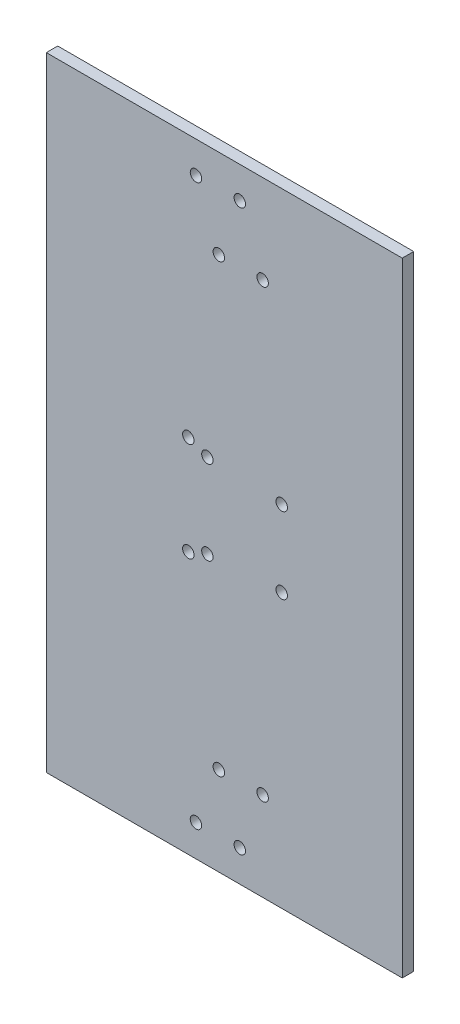
ISO-10303-21;
HEADER;
FILE_DESCRIPTION(('STEP AP214'),'2;1');
FILE_NAME('part.step','',(''),(''),'','','');
FILE_SCHEMA(('AUTOMOTIVE_DESIGN { 1 0 10303 214 1 1 1 1 }'));
ENDSEC;
DATA;
#1=APPLICATION_CONTEXT('core data for automotive mechanical design processes');
#2=APPLICATION_PROTOCOL_DEFINITION('international standard','automotive_design',2000,#1);
#3=PRODUCT_CONTEXT('',#1,'mechanical');
#4=PRODUCT('Part','Part','',(#3));
#5=PRODUCT_RELATED_PRODUCT_CATEGORY('part','',(#4));
#6=PRODUCT_DEFINITION_FORMATION('','',#4);
#7=PRODUCT_DEFINITION_CONTEXT('part definition',#1,'design');
#8=PRODUCT_DEFINITION('design','',#6,#7);
#9=PRODUCT_DEFINITION_SHAPE('','',#8);
#10=(LENGTH_UNIT() NAMED_UNIT(*) SI_UNIT(.MILLI.,.METRE.));
#11=(NAMED_UNIT(*) PLANE_ANGLE_UNIT() SI_UNIT($,.RADIAN.));
#12=(NAMED_UNIT(*) SI_UNIT($,.STERADIAN.) SOLID_ANGLE_UNIT());
#13=UNCERTAINTY_MEASURE_WITH_UNIT(LENGTH_MEASURE(1.E-05),#10,'distance_accuracy_value','');
#14=(GEOMETRIC_REPRESENTATION_CONTEXT(3) GLOBAL_UNCERTAINTY_ASSIGNED_CONTEXT((#13)) GLOBAL_UNIT_ASSIGNED_CONTEXT((#10,
#11,#12)) REPRESENTATION_CONTEXT('',''));
#15=CARTESIAN_POINT('',(0.,0.,0.));
#16=DIRECTION('',(0.,0.,1.));
#17=DIRECTION('',(1.,0.,0.));
#18=AXIS2_PLACEMENT_3D('',#15,#16,#17);
#19=CARTESIAN_POINT('',(0.,0.,3.));
#20=DIRECTION('',(0.,0.,1.));
#21=DIRECTION('',(1.,0.,0.));
#22=AXIS2_PLACEMENT_3D('',#19,#20,#21);
#23=PLANE('',#22);
#24=CARTESIAN_POINT('',(1.99999999999999,58.5,3.));
#25=DIRECTION('',(0.,0.,1.));
#26=DIRECTION('',(1.,0.,0.));
#27=AXIS2_PLACEMENT_3D('',#24,#25,#26);
#28=CIRCLE('',#27,1.5);
#29=CARTESIAN_POINT('',(3.5,58.5,3.));
#30=VERTEX_POINT('',#29);
#31=EDGE_CURVE('E320',#30,#30,#28,.T.);
#32=ORIENTED_EDGE('',*,*,#31,.F.);
#33=EDGE_LOOP('',(#32));
#34=FACE_BOUND('',#33,.T.);
#35=CARTESIAN_POINT('',(-1.,11.,3.));
#36=DIRECTION('',(0.,0.,1.));
#37=DIRECTION('',(1.,0.,0.));
#38=AXIS2_PLACEMENT_3D('',#35,#36,#37);
#39=CIRCLE('',#38,1.5);
#40=CARTESIAN_POINT('',(0.499999999999999,11.,3.));
#41=VERTEX_POINT('',#40);
#42=EDGE_CURVE('E332',#41,#41,#39,.T.);
#43=ORIENTED_EDGE('',*,*,#42,.F.);
#44=EDGE_LOOP('',(#43));
#45=FACE_BOUND('',#44,.T.);
#46=CARTESIAN_POINT('',(7.49999999999999,73.5,3.));
#47=DIRECTION('',(0.,0.,1.));
#48=DIRECTION('',(1.,0.,0.));
#49=AXIS2_PLACEMENT_3D('',#46,#47,#48);
#50=CIRCLE('',#49,1.5);
#51=CARTESIAN_POINT('',(8.99999999999999,73.5,3.));
#52=VERTEX_POINT('',#51);
#53=EDGE_CURVE('E344',#52,#52,#50,.T.);
#54=ORIENTED_EDGE('',*,*,#53,.F.);
#55=EDGE_LOOP('',(#54));
#56=FACE_BOUND('',#55,.T.);
#57=DIRECTION('',(0.,1.,0.));
#58=VECTOR('',#57,1.);
#59=CARTESIAN_POINT('',(-43.264162630959,0.,3.));
#60=LINE('',#59,#58);
#61=CARTESIAN_POINT('',(-43.264162630959,-81.7904457096533,3.));
#62=VERTEX_POINT('',#61);
#63=CARTESIAN_POINT('',(-43.264162630959,81.7904457096533,3.));
#64=VERTEX_POINT('',#63);
#65=EDGE_CURVE('E358',#62,#64,#60,.T.);
#66=ORIENTED_EDGE('',*,*,#65,.F.);
#67=DIRECTION('',(1.,0.,0.));
#68=VECTOR('',#67,1.);
#69=CARTESIAN_POINT('',(-43.264162630959,-81.7904457096533,3.));
#70=LINE('',#69,#68);
#71=CARTESIAN_POINT('',(50.1298788763802,-81.7904457096533,3.));
#72=VERTEX_POINT('',#71);
#73=EDGE_CURVE('E299',#62,#72,#70,.T.);
#74=ORIENTED_EDGE('',*,*,#73,.T.);
#75=DIRECTION('',(0.,1.,0.));
#76=VECTOR('',#75,1.);
#77=CARTESIAN_POINT('',(50.1298788763802,0.,3.));
#78=LINE('',#77,#76);
#79=CARTESIAN_POINT('',(50.1298788763802,81.7904457096533,3.));
#80=VERTEX_POINT('',#79);
#81=EDGE_CURVE('E273',#72,#80,#78,.T.);
#82=ORIENTED_EDGE('',*,*,#81,.T.);
#83=DIRECTION('',(1.,0.,0.));
#84=VECTOR('',#83,1.);
#85=CARTESIAN_POINT('',(-43.264162630959,81.7904457096533,3.));
#86=LINE('',#85,#84);
#87=EDGE_CURVE('E355',#64,#80,#86,.T.);
#88=ORIENTED_EDGE('',*,*,#87,.F.);
#89=EDGE_LOOP('',(#66,#74,#82,#88));
#90=FACE_BOUND('',#89,.T.);
#91=CARTESIAN_POINT('',(18.5,10.,3.));
#92=DIRECTION('',(0.,0.,1.));
#93=DIRECTION('',(1.,0.,0.));
#94=AXIS2_PLACEMENT_3D('',#91,#92,#93);
#95=CIRCLE('',#94,1.5);
#96=CARTESIAN_POINT('',(20.,10.,3.));
#97=VERTEX_POINT('',#96);
#98=EDGE_CURVE('E292',#97,#97,#95,.T.);
#99=ORIENTED_EDGE('',*,*,#98,.F.);
#100=EDGE_LOOP('',(#99));
#101=FACE_BOUND('',#100,.T.);
#102=CARTESIAN_POINT('',(-6.,13.,3.));
#103=DIRECTION('',(0.,0.,1.));
#104=DIRECTION('',(1.,0.,0.));
#105=AXIS2_PLACEMENT_3D('',#102,#103,#104);
#106=CIRCLE('',#105,1.5);
#107=CARTESIAN_POINT('',(-4.5,13.,3.));
#108=VERTEX_POINT('',#107);
#109=EDGE_CURVE('E338',#108,#108,#106,.T.);
#110=ORIENTED_EDGE('',*,*,#109,.F.);
#111=EDGE_LOOP('',(#110));
#112=FACE_BOUND('',#111,.T.);
#113=CARTESIAN_POINT('',(13.5,58.5,3.));
#114=DIRECTION('',(0.,0.,1.));
#115=DIRECTION('',(1.,0.,0.));
#116=AXIS2_PLACEMENT_3D('',#113,#114,#115);
#117=CIRCLE('',#116,1.5);
#118=CARTESIAN_POINT('',(15.,58.5,3.));
#119=VERTEX_POINT('',#118);
#120=EDGE_CURVE('E326',#119,#119,#117,.T.);
#121=ORIENTED_EDGE('',*,*,#120,.F.);
#122=EDGE_LOOP('',(#121));
#123=FACE_BOUND('',#122,.T.);
#124=CARTESIAN_POINT('',(-4.00000000000001,73.5,3.));
#125=DIRECTION('',(0.,0.,1.));
#126=DIRECTION('',(1.,0.,0.));
#127=AXIS2_PLACEMENT_3D('',#124,#125,#126);
#128=CIRCLE('',#127,1.5);
#129=CARTESIAN_POINT('',(-2.50000000000001,73.5,3.));
#130=VERTEX_POINT('',#129);
#131=EDGE_CURVE('E314',#130,#130,#128,.T.);
#132=ORIENTED_EDGE('',*,*,#131,.F.);
#133=EDGE_LOOP('',(#132));
#134=FACE_BOUND('',#133,.T.);
#135=CARTESIAN_POINT('',(-4.00000000000001,-73.5,3.));
#136=DIRECTION('',(0.,0.,-1.));
#137=DIRECTION('',(1.,0.,0.));
#138=AXIS2_PLACEMENT_3D('',#135,#136,#137);
#139=CIRCLE('',#138,1.5);
#140=CARTESIAN_POINT('',(-2.50000000000001,-73.5,3.));
#141=VERTEX_POINT('',#140);
#142=EDGE_CURVE('E443',#141,#141,#139,.T.);
#143=ORIENTED_EDGE('',*,*,#142,.T.);
#144=EDGE_LOOP('',(#143));
#145=FACE_BOUND('',#144,.T.);
#146=CARTESIAN_POINT('',(1.99999999999999,-58.5,3.));
#147=DIRECTION('',(0.,0.,-1.));
#148=DIRECTION('',(1.,0.,0.));
#149=AXIS2_PLACEMENT_3D('',#146,#147,#148);
#150=CIRCLE('',#149,1.5);
#151=CARTESIAN_POINT('',(3.5,-58.5,3.));
#152=VERTEX_POINT('',#151);
#153=EDGE_CURVE('E452',#152,#152,#150,.T.);
#154=ORIENTED_EDGE('',*,*,#153,.T.);
#155=EDGE_LOOP('',(#154));
#156=FACE_BOUND('',#155,.T.);
#157=CARTESIAN_POINT('',(13.5,-58.5,3.));
#158=DIRECTION('',(0.,0.,-1.));
#159=DIRECTION('',(1.,0.,0.));
#160=AXIS2_PLACEMENT_3D('',#157,#158,#159);
#161=CIRCLE('',#160,1.5);
#162=CARTESIAN_POINT('',(15.,-58.5,3.));
#163=VERTEX_POINT('',#162);
#164=EDGE_CURVE('E458',#163,#163,#161,.T.);
#165=ORIENTED_EDGE('',*,*,#164,.T.);
#166=EDGE_LOOP('',(#165));
#167=FACE_BOUND('',#166,.T.);
#168=CARTESIAN_POINT('',(-1.,-11.,3.));
#169=DIRECTION('',(0.,0.,-1.));
#170=DIRECTION('',(1.,0.,0.));
#171=AXIS2_PLACEMENT_3D('',#168,#169,#170);
#172=CIRCLE('',#171,1.5);
#173=CARTESIAN_POINT('',(0.499999999999999,-11.,3.));
#174=VERTEX_POINT('',#173);
#175=EDGE_CURVE('E464',#174,#174,#172,.T.);
#176=ORIENTED_EDGE('',*,*,#175,.T.);
#177=EDGE_LOOP('',(#176));
#178=FACE_BOUND('',#177,.T.);
#179=CARTESIAN_POINT('',(-6.,-13.,3.));
#180=DIRECTION('',(0.,0.,-1.));
#181=DIRECTION('',(1.,0.,0.));
#182=AXIS2_PLACEMENT_3D('',#179,#180,#181);
#183=CIRCLE('',#182,1.5);
#184=CARTESIAN_POINT('',(-4.5,-13.,3.));
#185=VERTEX_POINT('',#184);
#186=EDGE_CURVE('E470',#185,#185,#183,.T.);
#187=ORIENTED_EDGE('',*,*,#186,.T.);
#188=EDGE_LOOP('',(#187));
#189=FACE_BOUND('',#188,.T.);
#190=CARTESIAN_POINT('',(7.49999999999999,-73.5,3.));
#191=DIRECTION('',(0.,0.,-1.));
#192=DIRECTION('',(1.,0.,0.));
#193=AXIS2_PLACEMENT_3D('',#190,#191,#192);
#194=CIRCLE('',#193,1.5);
#195=CARTESIAN_POINT('',(8.99999999999999,-73.5,3.));
#196=VERTEX_POINT('',#195);
#197=EDGE_CURVE('E476',#196,#196,#194,.T.);
#198=ORIENTED_EDGE('',*,*,#197,.T.);
#199=EDGE_LOOP('',(#198));
#200=FACE_BOUND('',#199,.T.);
#201=CARTESIAN_POINT('',(18.5,-10.,3.));
#202=DIRECTION('',(0.,0.,-1.));
#203=DIRECTION('',(1.,0.,0.));
#204=AXIS2_PLACEMENT_3D('',#201,#202,#203);
#205=CIRCLE('',#204,1.5);
#206=CARTESIAN_POINT('',(20.,-10.,3.));
#207=VERTEX_POINT('',#206);
#208=EDGE_CURVE('E304',#207,#207,#205,.T.);
#209=ORIENTED_EDGE('',*,*,#208,.T.);
#210=EDGE_LOOP('',(#209));
#211=FACE_BOUND('',#210,.T.);
#212=ADVANCED_FACE('F243',(#34,#45,#56,#90,#101,#112,#123,#134,#145,#156,#167,#178,#189,#200,
#211),#23,.T.);
#213=CARTESIAN_POINT('',(0.,0.,0.));
#214=DIRECTION('',(0.,0.,1.));
#215=DIRECTION('',(1.,0.,0.));
#216=AXIS2_PLACEMENT_3D('',#213,#214,#215);
#217=PLANE('',#216);
#218=DIRECTION('',(0.,1.,0.));
#219=VECTOR('',#218,1.);
#220=CARTESIAN_POINT('',(50.1298788763802,0.,0.));
#221=LINE('',#220,#219);
#222=CARTESIAN_POINT('',(50.1298788763802,-81.7904457096533,0.));
#223=VERTEX_POINT('',#222);
#224=CARTESIAN_POINT('',(50.1298788763802,81.7904457096533,0.));
#225=VERTEX_POINT('',#224);
#226=EDGE_CURVE('E285',#223,#225,#221,.T.);
#227=ORIENTED_EDGE('',*,*,#226,.F.);
#228=DIRECTION('',(1.,0.,0.));
#229=VECTOR('',#228,1.);
#230=CARTESIAN_POINT('',(-43.264162630959,-81.7904457096533,0.));
#231=LINE('',#230,#229);
#232=CARTESIAN_POINT('',(-43.264162630959,-81.7904457096533,0.));
#233=VERTEX_POINT('',#232);
#234=EDGE_CURVE('E290',#233,#223,#231,.T.);
#235=ORIENTED_EDGE('',*,*,#234,.F.);
#236=DIRECTION('',(0.,1.,0.));
#237=VECTOR('',#236,1.);
#238=CARTESIAN_POINT('',(-43.264162630959,0.,0.));
#239=LINE('',#238,#237);
#240=CARTESIAN_POINT('',(-43.264162630959,81.7904457096533,0.));
#241=VERTEX_POINT('',#240);
#242=EDGE_CURVE('E356',#233,#241,#239,.T.);
#243=ORIENTED_EDGE('',*,*,#242,.T.);
#244=DIRECTION('',(1.,0.,0.));
#245=VECTOR('',#244,1.);
#246=CARTESIAN_POINT('',(-43.264162630959,81.7904457096533,0.));
#247=LINE('',#246,#245);
#248=EDGE_CURVE('E291',#241,#225,#247,.T.);
#249=ORIENTED_EDGE('',*,*,#248,.T.);
#250=EDGE_LOOP('',(#227,#235,#243,#249));
#251=FACE_BOUND('',#250,.T.);
#252=CARTESIAN_POINT('',(18.5,10.,0.));
#253=DIRECTION('',(0.,0.,1.));
#254=DIRECTION('',(1.,0.,0.));
#255=AXIS2_PLACEMENT_3D('',#252,#253,#254);
#256=CIRCLE('',#255,1.5);
#257=CARTESIAN_POINT('',(20.,10.,0.));
#258=VERTEX_POINT('',#257);
#259=EDGE_CURVE('E347',#258,#258,#256,.T.);
#260=ORIENTED_EDGE('',*,*,#259,.T.);
#261=EDGE_LOOP('',(#260));
#262=FACE_BOUND('',#261,.T.);
#263=CARTESIAN_POINT('',(7.49999999999999,73.5,0.));
#264=DIRECTION('',(0.,0.,1.));
#265=DIRECTION('',(1.,0.,0.));
#266=AXIS2_PLACEMENT_3D('',#263,#264,#265);
#267=CIRCLE('',#266,1.5);
#268=CARTESIAN_POINT('',(8.99999999999999,73.5,0.));
#269=VERTEX_POINT('',#268);
#270=EDGE_CURVE('E341',#269,#269,#267,.T.);
#271=ORIENTED_EDGE('',*,*,#270,.T.);
#272=EDGE_LOOP('',(#271));
#273=FACE_BOUND('',#272,.T.);
#274=CARTESIAN_POINT('',(-6.,13.,0.));
#275=DIRECTION('',(0.,0.,1.));
#276=DIRECTION('',(1.,0.,0.));
#277=AXIS2_PLACEMENT_3D('',#274,#275,#276);
#278=CIRCLE('',#277,1.5);
#279=CARTESIAN_POINT('',(-4.5,13.,0.));
#280=VERTEX_POINT('',#279);
#281=EDGE_CURVE('E335',#280,#280,#278,.T.);
#282=ORIENTED_EDGE('',*,*,#281,.T.);
#283=EDGE_LOOP('',(#282));
#284=FACE_BOUND('',#283,.T.);
#285=CARTESIAN_POINT('',(-1.,11.,0.));
#286=DIRECTION('',(0.,0.,1.));
#287=DIRECTION('',(1.,0.,0.));
#288=AXIS2_PLACEMENT_3D('',#285,#286,#287);
#289=CIRCLE('',#288,1.5);
#290=CARTESIAN_POINT('',(0.499999999999999,11.,0.));
#291=VERTEX_POINT('',#290);
#292=EDGE_CURVE('E329',#291,#291,#289,.T.);
#293=ORIENTED_EDGE('',*,*,#292,.T.);
#294=EDGE_LOOP('',(#293));
#295=FACE_BOUND('',#294,.T.);
#296=CARTESIAN_POINT('',(13.5,58.5,0.));
#297=DIRECTION('',(0.,0.,1.));
#298=DIRECTION('',(1.,0.,0.));
#299=AXIS2_PLACEMENT_3D('',#296,#297,#298);
#300=CIRCLE('',#299,1.5);
#301=CARTESIAN_POINT('',(15.,58.5,0.));
#302=VERTEX_POINT('',#301);
#303=EDGE_CURVE('E323',#302,#302,#300,.T.);
#304=ORIENTED_EDGE('',*,*,#303,.T.);
#305=EDGE_LOOP('',(#304));
#306=FACE_BOUND('',#305,.T.);
#307=CARTESIAN_POINT('',(1.99999999999999,58.5,0.));
#308=DIRECTION('',(0.,0.,1.));
#309=DIRECTION('',(1.,0.,0.));
#310=AXIS2_PLACEMENT_3D('',#307,#308,#309);
#311=CIRCLE('',#310,1.5);
#312=CARTESIAN_POINT('',(3.5,58.5,0.));
#313=VERTEX_POINT('',#312);
#314=EDGE_CURVE('E317',#313,#313,#311,.T.);
#315=ORIENTED_EDGE('',*,*,#314,.T.);
#316=EDGE_LOOP('',(#315));
#317=FACE_BOUND('',#316,.T.);
#318=CARTESIAN_POINT('',(-4.00000000000001,73.5,0.));
#319=DIRECTION('',(0.,0.,1.));
#320=DIRECTION('',(1.,0.,0.));
#321=AXIS2_PLACEMENT_3D('',#318,#319,#320);
#322=CIRCLE('',#321,1.5);
#323=CARTESIAN_POINT('',(-2.50000000000001,73.5,0.));
#324=VERTEX_POINT('',#323);
#325=EDGE_CURVE('E313',#324,#324,#322,.T.);
#326=ORIENTED_EDGE('',*,*,#325,.T.);
#327=EDGE_LOOP('',(#326));
#328=FACE_BOUND('',#327,.T.);
#329=CARTESIAN_POINT('',(-4.00000000000001,-73.5,0.));
#330=DIRECTION('',(0.,0.,-1.));
#331=DIRECTION('',(1.,0.,0.));
#332=AXIS2_PLACEMENT_3D('',#329,#330,#331);
#333=CIRCLE('',#332,1.5);
#334=CARTESIAN_POINT('',(-2.50000000000001,-73.5,0.));
#335=VERTEX_POINT('',#334);
#336=EDGE_CURVE('E446',#335,#335,#333,.T.);
#337=ORIENTED_EDGE('',*,*,#336,.F.);
#338=EDGE_LOOP('',(#337));
#339=FACE_BOUND('',#338,.T.);
#340=CARTESIAN_POINT('',(1.99999999999999,-58.5,0.));
#341=DIRECTION('',(0.,0.,-1.));
#342=DIRECTION('',(1.,0.,0.));
#343=AXIS2_PLACEMENT_3D('',#340,#341,#342);
#344=CIRCLE('',#343,1.5);
#345=CARTESIAN_POINT('',(3.5,-58.5,0.));
#346=VERTEX_POINT('',#345);
#347=EDGE_CURVE('E449',#346,#346,#344,.T.);
#348=ORIENTED_EDGE('',*,*,#347,.F.);
#349=EDGE_LOOP('',(#348));
#350=FACE_BOUND('',#349,.T.);
#351=CARTESIAN_POINT('',(13.5,-58.5,0.));
#352=DIRECTION('',(0.,0.,-1.));
#353=DIRECTION('',(1.,0.,0.));
#354=AXIS2_PLACEMENT_3D('',#351,#352,#353);
#355=CIRCLE('',#354,1.5);
#356=CARTESIAN_POINT('',(15.,-58.5,0.));
#357=VERTEX_POINT('',#356);
#358=EDGE_CURVE('E455',#357,#357,#355,.T.);
#359=ORIENTED_EDGE('',*,*,#358,.F.);
#360=EDGE_LOOP('',(#359));
#361=FACE_BOUND('',#360,.T.);
#362=CARTESIAN_POINT('',(-1.,-11.,0.));
#363=DIRECTION('',(0.,0.,-1.));
#364=DIRECTION('',(1.,0.,0.));
#365=AXIS2_PLACEMENT_3D('',#362,#363,#364);
#366=CIRCLE('',#365,1.5);
#367=CARTESIAN_POINT('',(0.499999999999999,-11.,0.));
#368=VERTEX_POINT('',#367);
#369=EDGE_CURVE('E461',#368,#368,#366,.T.);
#370=ORIENTED_EDGE('',*,*,#369,.F.);
#371=EDGE_LOOP('',(#370));
#372=FACE_BOUND('',#371,.T.);
#373=CARTESIAN_POINT('',(-6.,-13.,0.));
#374=DIRECTION('',(0.,0.,-1.));
#375=DIRECTION('',(1.,0.,0.));
#376=AXIS2_PLACEMENT_3D('',#373,#374,#375);
#377=CIRCLE('',#376,1.5);
#378=CARTESIAN_POINT('',(-4.5,-13.,0.));
#379=VERTEX_POINT('',#378);
#380=EDGE_CURVE('E467',#379,#379,#377,.T.);
#381=ORIENTED_EDGE('',*,*,#380,.F.);
#382=EDGE_LOOP('',(#381));
#383=FACE_BOUND('',#382,.T.);
#384=CARTESIAN_POINT('',(7.49999999999999,-73.5,0.));
#385=DIRECTION('',(0.,0.,-1.));
#386=DIRECTION('',(1.,0.,0.));
#387=AXIS2_PLACEMENT_3D('',#384,#385,#386);
#388=CIRCLE('',#387,1.5);
#389=CARTESIAN_POINT('',(8.99999999999999,-73.5,0.));
#390=VERTEX_POINT('',#389);
#391=EDGE_CURVE('E473',#390,#390,#388,.T.);
#392=ORIENTED_EDGE('',*,*,#391,.F.);
#393=EDGE_LOOP('',(#392));
#394=FACE_BOUND('',#393,.T.);
#395=CARTESIAN_POINT('',(18.5,-10.,0.));
#396=DIRECTION('',(0.,0.,-1.));
#397=DIRECTION('',(1.,0.,0.));
#398=AXIS2_PLACEMENT_3D('',#395,#396,#397);
#399=CIRCLE('',#398,1.5);
#400=CARTESIAN_POINT('',(20.,-10.,0.));
#401=VERTEX_POINT('',#400);
#402=EDGE_CURVE('E308',#401,#401,#399,.T.);
#403=ORIENTED_EDGE('',*,*,#402,.F.);
#404=EDGE_LOOP('',(#403));
#405=FACE_BOUND('',#404,.T.);
#406=ADVANCED_FACE('F286',(#251,#262,#273,#284,#295,#306,#317,#328,#339,#350,#361,#372,#383,
#394,#405),#217,.F.);
#407=CARTESIAN_POINT('',(50.1298788763802,0.,3.));
#408=DIRECTION('',(-1.,0.,0.));
#409=DIRECTION('',(0.,0.,1.));
#410=AXIS2_PLACEMENT_3D('',#407,#408,#409);
#411=PLANE('',#410);
#412=ORIENTED_EDGE('',*,*,#226,.T.);
#413=DIRECTION('',(0.,0.,-1.));
#414=VECTOR('',#413,1.);
#415=CARTESIAN_POINT('',(50.1298788763802,81.7904457096533,3.));
#416=LINE('',#415,#414);
#417=EDGE_CURVE('E12',#80,#225,#416,.T.);
#418=ORIENTED_EDGE('',*,*,#417,.F.);
#419=ORIENTED_EDGE('',*,*,#81,.F.);
#420=DIRECTION('',(0.,0.,-1.));
#421=VECTOR('',#420,1.);
#422=CARTESIAN_POINT('',(50.1298788763802,-81.7904457096533,3.));
#423=LINE('',#422,#421);
#424=EDGE_CURVE('E295',#72,#223,#423,.T.);
#425=ORIENTED_EDGE('',*,*,#424,.T.);
#426=EDGE_LOOP('',(#412,#418,#419,#425));
#427=FACE_BOUND('',#426,.T.);
#428=ADVANCED_FACE('F245',(#427),#411,.F.);
#429=CARTESIAN_POINT('',(-43.264162630959,81.7904457096533,3.));
#430=DIRECTION('',(0.,1.,0.));
#431=DIRECTION('',(0.,0.,1.));
#432=AXIS2_PLACEMENT_3D('',#429,#430,#431);
#433=PLANE('',#432);
#434=ORIENTED_EDGE('',*,*,#248,.F.);
#435=DIRECTION('',(0.,0.,-1.));
#436=VECTOR('',#435,1.);
#437=CARTESIAN_POINT('',(-43.264162630959,81.7904457096533,3.));
#438=LINE('',#437,#436);
#439=EDGE_CURVE('E252',#64,#241,#438,.T.);
#440=ORIENTED_EDGE('',*,*,#439,.F.);
#441=ORIENTED_EDGE('',*,*,#87,.T.);
#442=ORIENTED_EDGE('',*,*,#417,.T.);
#443=EDGE_LOOP('',(#434,#440,#441,#442));
#444=FACE_BOUND('',#443,.T.);
#445=ADVANCED_FACE('F364',(#444),#433,.T.);
#446=CARTESIAN_POINT('',(-43.264162630959,0.,3.));
#447=DIRECTION('',(-1.,0.,0.));
#448=DIRECTION('',(0.,0.,1.));
#449=AXIS2_PLACEMENT_3D('',#446,#447,#448);
#450=PLANE('',#449);
#451=ORIENTED_EDGE('',*,*,#242,.F.);
#452=DIRECTION('',(0.,0.,-1.));
#453=VECTOR('',#452,1.);
#454=CARTESIAN_POINT('',(-43.264162630959,-81.7904457096533,3.));
#455=LINE('',#454,#453);
#456=EDGE_CURVE('E298',#62,#233,#455,.T.);
#457=ORIENTED_EDGE('',*,*,#456,.F.);
#458=ORIENTED_EDGE('',*,*,#65,.T.);
#459=ORIENTED_EDGE('',*,*,#439,.T.);
#460=EDGE_LOOP('',(#451,#457,#458,#459));
#461=FACE_BOUND('',#460,.T.);
#462=ADVANCED_FACE('F363',(#461),#450,.T.);
#463=CARTESIAN_POINT('',(18.5,10.,3.));
#464=DIRECTION('',(0.,0.,-1.));
#465=DIRECTION('',(-1.,0.,0.));
#466=AXIS2_PLACEMENT_3D('',#463,#464,#465);
#467=CYLINDRICAL_SURFACE('',#466,1.5);
#468=ORIENTED_EDGE('',*,*,#98,.T.);
#469=EDGE_LOOP('',(#468));
#470=FACE_BOUND('',#469,.T.);
#471=ORIENTED_EDGE('',*,*,#259,.F.);
#472=EDGE_LOOP('',(#471));
#473=FACE_BOUND('',#472,.T.);
#474=ADVANCED_FACE('F370',(#470,#473),#467,.F.);
#475=CARTESIAN_POINT('',(7.49999999999999,73.5,3.));
#476=DIRECTION('',(0.,0.,-1.));
#477=DIRECTION('',(-1.,0.,0.));
#478=AXIS2_PLACEMENT_3D('',#475,#476,#477);
#479=CYLINDRICAL_SURFACE('',#478,1.5);
#480=ORIENTED_EDGE('',*,*,#53,.T.);
#481=EDGE_LOOP('',(#480));
#482=FACE_BOUND('',#481,.T.);
#483=ORIENTED_EDGE('',*,*,#270,.F.);
#484=EDGE_LOOP('',(#483));
#485=FACE_BOUND('',#484,.T.);
#486=ADVANCED_FACE('F384',(#482,#485),#479,.F.);
#487=CARTESIAN_POINT('',(-6.,13.,3.));
#488=DIRECTION('',(0.,0.,-1.));
#489=DIRECTION('',(-1.,0.,0.));
#490=AXIS2_PLACEMENT_3D('',#487,#488,#489);
#491=CYLINDRICAL_SURFACE('',#490,1.5);
#492=ORIENTED_EDGE('',*,*,#109,.T.);
#493=EDGE_LOOP('',(#492));
#494=FACE_BOUND('',#493,.T.);
#495=ORIENTED_EDGE('',*,*,#281,.F.);
#496=EDGE_LOOP('',(#495));
#497=FACE_BOUND('',#496,.T.);
#498=ADVANCED_FACE('F388',(#494,#497),#491,.F.);
#499=CARTESIAN_POINT('',(-1.,11.,3.));
#500=DIRECTION('',(0.,0.,-1.));
#501=DIRECTION('',(-1.,0.,0.));
#502=AXIS2_PLACEMENT_3D('',#499,#500,#501);
#503=CYLINDRICAL_SURFACE('',#502,1.5);
#504=ORIENTED_EDGE('',*,*,#42,.T.);
#505=EDGE_LOOP('',(#504));
#506=FACE_BOUND('',#505,.T.);
#507=ORIENTED_EDGE('',*,*,#292,.F.);
#508=EDGE_LOOP('',(#507));
#509=FACE_BOUND('',#508,.T.);
#510=ADVANCED_FACE('F392',(#506,#509),#503,.F.);
#511=CARTESIAN_POINT('',(13.5,58.5,3.));
#512=DIRECTION('',(0.,0.,-1.));
#513=DIRECTION('',(-1.,0.,0.));
#514=AXIS2_PLACEMENT_3D('',#511,#512,#513);
#515=CYLINDRICAL_SURFACE('',#514,1.5);
#516=ORIENTED_EDGE('',*,*,#120,.T.);
#517=EDGE_LOOP('',(#516));
#518=FACE_BOUND('',#517,.T.);
#519=ORIENTED_EDGE('',*,*,#303,.F.);
#520=EDGE_LOOP('',(#519));
#521=FACE_BOUND('',#520,.T.);
#522=ADVANCED_FACE('F396',(#518,#521),#515,.F.);
#523=CARTESIAN_POINT('',(1.99999999999999,58.5,3.));
#524=DIRECTION('',(0.,0.,-1.));
#525=DIRECTION('',(-1.,0.,0.));
#526=AXIS2_PLACEMENT_3D('',#523,#524,#525);
#527=CYLINDRICAL_SURFACE('',#526,1.5);
#528=ORIENTED_EDGE('',*,*,#31,.T.);
#529=EDGE_LOOP('',(#528));
#530=FACE_BOUND('',#529,.T.);
#531=ORIENTED_EDGE('',*,*,#314,.F.);
#532=EDGE_LOOP('',(#531));
#533=FACE_BOUND('',#532,.T.);
#534=ADVANCED_FACE('F400',(#530,#533),#527,.F.);
#535=CARTESIAN_POINT('',(-4.00000000000001,73.5,3.));
#536=DIRECTION('',(0.,0.,-1.));
#537=DIRECTION('',(-1.,0.,0.));
#538=AXIS2_PLACEMENT_3D('',#535,#536,#537);
#539=CYLINDRICAL_SURFACE('',#538,1.5);
#540=ORIENTED_EDGE('',*,*,#131,.T.);
#541=EDGE_LOOP('',(#540));
#542=FACE_BOUND('',#541,.T.);
#543=ORIENTED_EDGE('',*,*,#325,.F.);
#544=EDGE_LOOP('',(#543));
#545=FACE_BOUND('',#544,.T.);
#546=ADVANCED_FACE('F404',(#542,#545),#539,.F.);
#547=CARTESIAN_POINT('',(-43.264162630959,-81.7904457096533,3.));
#548=DIRECTION('',(0.,1.,0.));
#549=DIRECTION('',(0.,0.,1.));
#550=AXIS2_PLACEMENT_3D('',#547,#548,#549);
#551=PLANE('',#550);
#552=ORIENTED_EDGE('',*,*,#234,.T.);
#553=ORIENTED_EDGE('',*,*,#424,.F.);
#554=ORIENTED_EDGE('',*,*,#73,.F.);
#555=ORIENTED_EDGE('',*,*,#456,.T.);
#556=EDGE_LOOP('',(#552,#553,#554,#555));
#557=FACE_BOUND('',#556,.T.);
#558=ADVANCED_FACE('F302',(#557),#551,.F.);
#559=CARTESIAN_POINT('',(18.5,-10.,3.));
#560=DIRECTION('',(0.,0.,-1.));
#561=DIRECTION('',(-1.,0.,0.));
#562=AXIS2_PLACEMENT_3D('',#559,#560,#561);
#563=CYLINDRICAL_SURFACE('',#562,1.5);
#564=ORIENTED_EDGE('',*,*,#208,.F.);
#565=EDGE_LOOP('',(#564));
#566=FACE_BOUND('',#565,.T.);
#567=ORIENTED_EDGE('',*,*,#402,.T.);
#568=EDGE_LOOP('',(#567));
#569=FACE_BOUND('',#568,.T.);
#570=ADVANCED_FACE('F411',(#566,#569),#563,.F.);
#571=CARTESIAN_POINT('',(7.49999999999999,-73.5,3.));
#572=DIRECTION('',(0.,0.,-1.));
#573=DIRECTION('',(-1.,0.,0.));
#574=AXIS2_PLACEMENT_3D('',#571,#572,#573);
#575=CYLINDRICAL_SURFACE('',#574,1.5);
#576=ORIENTED_EDGE('',*,*,#197,.F.);
#577=EDGE_LOOP('',(#576));
#578=FACE_BOUND('',#577,.T.);
#579=ORIENTED_EDGE('',*,*,#391,.T.);
#580=EDGE_LOOP('',(#579));
#581=FACE_BOUND('',#580,.T.);
#582=ADVANCED_FACE('F414',(#578,#581),#575,.F.);
#583=CARTESIAN_POINT('',(-6.,-13.,3.));
#584=DIRECTION('',(0.,0.,-1.));
#585=DIRECTION('',(-1.,0.,0.));
#586=AXIS2_PLACEMENT_3D('',#583,#584,#585);
#587=CYLINDRICAL_SURFACE('',#586,1.5);
#588=ORIENTED_EDGE('',*,*,#186,.F.);
#589=EDGE_LOOP('',(#588));
#590=FACE_BOUND('',#589,.T.);
#591=ORIENTED_EDGE('',*,*,#380,.T.);
#592=EDGE_LOOP('',(#591));
#593=FACE_BOUND('',#592,.T.);
#594=ADVANCED_FACE('F418',(#590,#593),#587,.F.);
#595=CARTESIAN_POINT('',(-1.,-11.,3.));
#596=DIRECTION('',(0.,0.,-1.));
#597=DIRECTION('',(-1.,0.,0.));
#598=AXIS2_PLACEMENT_3D('',#595,#596,#597);
#599=CYLINDRICAL_SURFACE('',#598,1.5);
#600=ORIENTED_EDGE('',*,*,#175,.F.);
#601=EDGE_LOOP('',(#600));
#602=FACE_BOUND('',#601,.T.);
#603=ORIENTED_EDGE('',*,*,#369,.T.);
#604=EDGE_LOOP('',(#603));
#605=FACE_BOUND('',#604,.T.);
#606=ADVANCED_FACE('F422',(#602,#605),#599,.F.);
#607=CARTESIAN_POINT('',(13.5,-58.5,3.));
#608=DIRECTION('',(0.,0.,-1.));
#609=DIRECTION('',(-1.,0.,0.));
#610=AXIS2_PLACEMENT_3D('',#607,#608,#609);
#611=CYLINDRICAL_SURFACE('',#610,1.5);
#612=ORIENTED_EDGE('',*,*,#164,.F.);
#613=EDGE_LOOP('',(#612));
#614=FACE_BOUND('',#613,.T.);
#615=ORIENTED_EDGE('',*,*,#358,.T.);
#616=EDGE_LOOP('',(#615));
#617=FACE_BOUND('',#616,.T.);
#618=ADVANCED_FACE('F426',(#614,#617),#611,.F.);
#619=CARTESIAN_POINT('',(1.99999999999999,-58.5,3.));
#620=DIRECTION('',(0.,0.,-1.));
#621=DIRECTION('',(-1.,0.,0.));
#622=AXIS2_PLACEMENT_3D('',#619,#620,#621);
#623=CYLINDRICAL_SURFACE('',#622,1.5);
#624=ORIENTED_EDGE('',*,*,#153,.F.);
#625=EDGE_LOOP('',(#624));
#626=FACE_BOUND('',#625,.T.);
#627=ORIENTED_EDGE('',*,*,#347,.T.);
#628=EDGE_LOOP('',(#627));
#629=FACE_BOUND('',#628,.T.);
#630=ADVANCED_FACE('F430',(#626,#629),#623,.F.);
#631=CARTESIAN_POINT('',(-4.00000000000001,-73.5,3.));
#632=DIRECTION('',(0.,0.,-1.));
#633=DIRECTION('',(-1.,0.,0.));
#634=AXIS2_PLACEMENT_3D('',#631,#632,#633);
#635=CYLINDRICAL_SURFACE('',#634,1.5);
#636=ORIENTED_EDGE('',*,*,#142,.F.);
#637=EDGE_LOOP('',(#636));
#638=FACE_BOUND('',#637,.T.);
#639=ORIENTED_EDGE('',*,*,#336,.T.);
#640=EDGE_LOOP('',(#639));
#641=FACE_BOUND('',#640,.T.);
#642=ADVANCED_FACE('F434',(#638,#641),#635,.F.);
#643=CLOSED_SHELL('',(#212,#406,#428,#445,#462,#474,#486,#498,#510,#522,#534,#546,#558,#570,
#582,#594,#606,#618,#630,#642));
#644=MANIFOLD_SOLID_BREP('B2',#643);
#645=ADVANCED_BREP_SHAPE_REPRESENTATION('',(#18,#644),#14);
#646=SHAPE_DEFINITION_REPRESENTATION(#9,#645);
ENDSEC;
END-ISO-10303-21;
